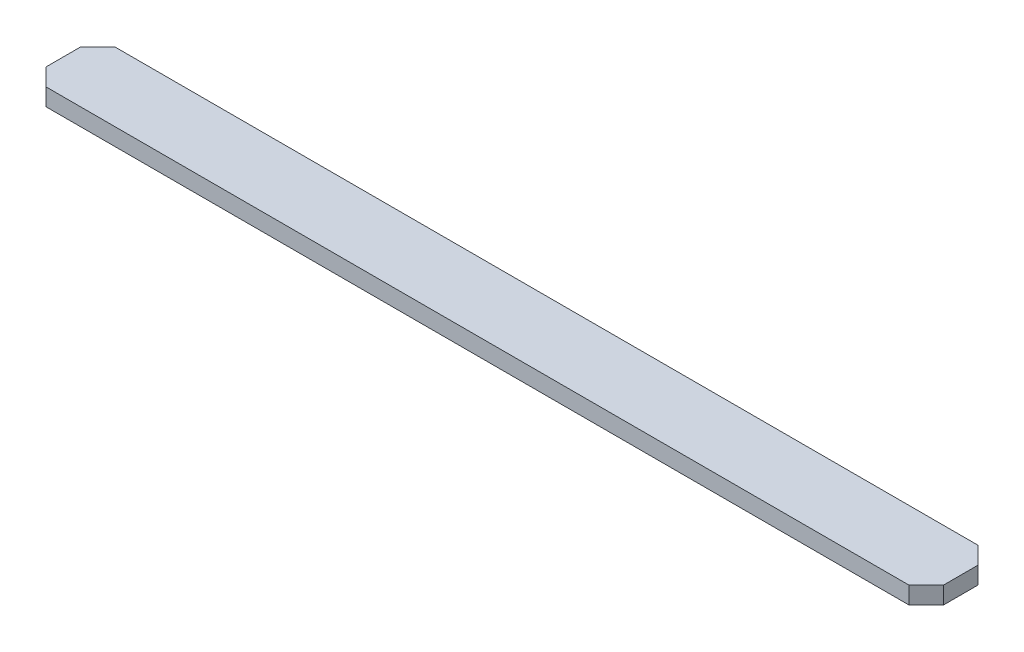
ISO-10303-21;
HEADER;
FILE_DESCRIPTION(('STEP AP214'),'2;1');
FILE_NAME('part.step','',(''),(''),'','','');
FILE_SCHEMA(('AUTOMOTIVE_DESIGN { 1 0 10303 214 1 1 1 1 }'));
ENDSEC;
DATA;
#1=APPLICATION_CONTEXT('core data for automotive mechanical design processes');
#2=APPLICATION_PROTOCOL_DEFINITION('international standard','automotive_design',2000,#1);
#3=PRODUCT_CONTEXT('',#1,'mechanical');
#4=PRODUCT('Part','Part','',(#3));
#5=PRODUCT_RELATED_PRODUCT_CATEGORY('part','',(#4));
#6=PRODUCT_DEFINITION_FORMATION('','',#4);
#7=PRODUCT_DEFINITION_CONTEXT('part definition',#1,'design');
#8=PRODUCT_DEFINITION('design','',#6,#7);
#9=PRODUCT_DEFINITION_SHAPE('','',#8);
#10=(LENGTH_UNIT() NAMED_UNIT(*) SI_UNIT(.MILLI.,.METRE.));
#11=(NAMED_UNIT(*) PLANE_ANGLE_UNIT() SI_UNIT($,.RADIAN.));
#12=(NAMED_UNIT(*) SI_UNIT($,.STERADIAN.) SOLID_ANGLE_UNIT());
#13=UNCERTAINTY_MEASURE_WITH_UNIT(LENGTH_MEASURE(1.E-05),#10,'distance_accuracy_value','');
#14=(GEOMETRIC_REPRESENTATION_CONTEXT(3) GLOBAL_UNCERTAINTY_ASSIGNED_CONTEXT((#13)) GLOBAL_UNIT_ASSIGNED_CONTEXT((#10,
#11,#12)) REPRESENTATION_CONTEXT('',''));
#15=CARTESIAN_POINT('',(0.,0.,0.));
#16=DIRECTION('',(0.,0.,1.));
#17=DIRECTION('',(1.,0.,0.));
#18=AXIS2_PLACEMENT_3D('',#15,#16,#17);
#19=CARTESIAN_POINT('',(26.,1.,-2.));
#20=DIRECTION('',(-1.,0.,0.));
#21=DIRECTION('',(0.,0.,1.));
#22=AXIS2_PLACEMENT_3D('',#19,#20,#21);
#23=PLANE('',#22);
#24=DIRECTION('',(0.,0.,-1.));
#25=VECTOR('',#24,1.);
#26=CARTESIAN_POINT('',(26.,0.,-2.));
#27=LINE('',#26,#25);
#28=CARTESIAN_POINT('',(26.,0.,0.999999999999999));
#29=VERTEX_POINT('',#28);
#30=CARTESIAN_POINT('',(26.,0.,-1.));
#31=VERTEX_POINT('',#30);
#32=EDGE_CURVE('E129',#29,#31,#27,.T.);
#33=ORIENTED_EDGE('',*,*,#32,.T.);
#34=DIRECTION('',(0.,1.,0.));
#35=VECTOR('',#34,1.);
#36=CARTESIAN_POINT('',(26.,1.,-1.));
#37=LINE('',#36,#35);
#38=CARTESIAN_POINT('',(26.,1.,-1.));
#39=VERTEX_POINT('',#38);
#40=EDGE_CURVE('E11',#31,#39,#37,.T.);
#41=ORIENTED_EDGE('',*,*,#40,.T.);
#42=DIRECTION('',(0.,0.,-1.));
#43=VECTOR('',#42,1.);
#44=CARTESIAN_POINT('',(26.,1.,-2.));
#45=LINE('',#44,#43);
#46=CARTESIAN_POINT('',(26.,1.,0.999999999999999));
#47=VERTEX_POINT('',#46);
#48=EDGE_CURVE('E127',#47,#39,#45,.T.);
#49=ORIENTED_EDGE('',*,*,#48,.F.);
#50=DIRECTION('',(0.,-1.,0.));
#51=VECTOR('',#50,1.);
#52=CARTESIAN_POINT('',(26.,1.,0.999999999999999));
#53=LINE('',#52,#51);
#54=EDGE_CURVE('E41',#47,#29,#53,.T.);
#55=ORIENTED_EDGE('',*,*,#54,.T.);
#56=EDGE_LOOP('',(#33,#41,#49,#55));
#57=FACE_BOUND('',#56,.T.);
#58=ADVANCED_FACE('F33',(#57),#23,.F.);
#59=CARTESIAN_POINT('',(-26.,1.,-2.));
#60=DIRECTION('',(0.,0.,1.));
#61=DIRECTION('',(1.,0.,0.));
#62=AXIS2_PLACEMENT_3D('',#59,#60,#61);
#63=PLANE('',#62);
#64=DIRECTION('',(-1.,0.,0.));
#65=VECTOR('',#64,1.);
#66=CARTESIAN_POINT('',(-26.,0.,-2.));
#67=LINE('',#66,#65);
#68=CARTESIAN_POINT('',(25.,0.,-2.));
#69=VERTEX_POINT('',#68);
#70=CARTESIAN_POINT('',(-25.,0.,-2.));
#71=VERTEX_POINT('',#70);
#72=EDGE_CURVE('E125',#69,#71,#67,.T.);
#73=ORIENTED_EDGE('',*,*,#72,.T.);
#74=DIRECTION('',(0.,1.,0.));
#75=VECTOR('',#74,1.);
#76=CARTESIAN_POINT('',(-25.,1.,-2.));
#77=LINE('',#76,#75);
#78=CARTESIAN_POINT('',(-25.,1.,-2.));
#79=VERTEX_POINT('',#78);
#80=EDGE_CURVE('E104',#71,#79,#77,.T.);
#81=ORIENTED_EDGE('',*,*,#80,.T.);
#82=DIRECTION('',(-1.,0.,0.));
#83=VECTOR('',#82,1.);
#84=CARTESIAN_POINT('',(-26.,1.,-2.));
#85=LINE('',#84,#83);
#86=CARTESIAN_POINT('',(25.,1.,-2.));
#87=VERTEX_POINT('',#86);
#88=EDGE_CURVE('E165',#87,#79,#85,.T.);
#89=ORIENTED_EDGE('',*,*,#88,.F.);
#90=DIRECTION('',(0.,-1.,0.));
#91=VECTOR('',#90,1.);
#92=CARTESIAN_POINT('',(25.,1.,-2.));
#93=LINE('',#92,#91);
#94=EDGE_CURVE('E109',#87,#69,#93,.T.);
#95=ORIENTED_EDGE('',*,*,#94,.T.);
#96=EDGE_LOOP('',(#73,#81,#89,#95));
#97=FACE_BOUND('',#96,.T.);
#98=ADVANCED_FACE('F175',(#97),#63,.F.);
#99=CARTESIAN_POINT('',(-26.,1.,-2.));
#100=DIRECTION('',(1.,0.,0.));
#101=DIRECTION('',(0.,0.,-1.));
#102=AXIS2_PLACEMENT_3D('',#99,#100,#101);
#103=PLANE('',#102);
#104=DIRECTION('',(0.,0.,1.));
#105=VECTOR('',#104,1.);
#106=CARTESIAN_POINT('',(-26.,1.,-2.));
#107=LINE('',#106,#105);
#108=CARTESIAN_POINT('',(-26.,1.,-1.));
#109=VERTEX_POINT('',#108);
#110=CARTESIAN_POINT('',(-26.,1.,0.999999999999999));
#111=VERTEX_POINT('',#110);
#112=EDGE_CURVE('E118',#109,#111,#107,.T.);
#113=ORIENTED_EDGE('',*,*,#112,.F.);
#114=DIRECTION('',(0.,-1.,0.));
#115=VECTOR('',#114,1.);
#116=CARTESIAN_POINT('',(-26.,1.,-1.));
#117=LINE('',#116,#115);
#118=CARTESIAN_POINT('',(-26.,0.,-1.));
#119=VERTEX_POINT('',#118);
#120=EDGE_CURVE('E103',#109,#119,#117,.T.);
#121=ORIENTED_EDGE('',*,*,#120,.T.);
#122=DIRECTION('',(0.,0.,1.));
#123=VECTOR('',#122,1.);
#124=CARTESIAN_POINT('',(-26.,0.,-2.));
#125=LINE('',#124,#123);
#126=CARTESIAN_POINT('',(-26.,0.,0.999999999999999));
#127=VERTEX_POINT('',#126);
#128=EDGE_CURVE('E116',#119,#127,#125,.T.);
#129=ORIENTED_EDGE('',*,*,#128,.T.);
#130=DIRECTION('',(0.,1.,0.));
#131=VECTOR('',#130,1.);
#132=CARTESIAN_POINT('',(-26.,1.,0.999999999999999));
#133=LINE('',#132,#131);
#134=EDGE_CURVE('E120',#127,#111,#133,.T.);
#135=ORIENTED_EDGE('',*,*,#134,.T.);
#136=EDGE_LOOP('',(#113,#121,#129,#135));
#137=FACE_BOUND('',#136,.T.);
#138=ADVANCED_FACE('F115',(#137),#103,.F.);
#139=CARTESIAN_POINT('',(-26.,1.,2.));
#140=DIRECTION('',(0.,0.,-1.));
#141=DIRECTION('',(-1.,0.,0.));
#142=AXIS2_PLACEMENT_3D('',#139,#140,#141);
#143=PLANE('',#142);
#144=DIRECTION('',(1.,0.,0.));
#145=VECTOR('',#144,1.);
#146=CARTESIAN_POINT('',(-26.,1.,2.));
#147=LINE('',#146,#145);
#148=CARTESIAN_POINT('',(-25.,1.,2.));
#149=VERTEX_POINT('',#148);
#150=CARTESIAN_POINT('',(25.,1.,2.));
#151=VERTEX_POINT('',#150);
#152=EDGE_CURVE('E133',#149,#151,#147,.T.);
#153=ORIENTED_EDGE('',*,*,#152,.F.);
#154=DIRECTION('',(0.,-1.,0.));
#155=VECTOR('',#154,1.);
#156=CARTESIAN_POINT('',(-25.,1.,2.));
#157=LINE('',#156,#155);
#158=CARTESIAN_POINT('',(-25.,0.,2.));
#159=VERTEX_POINT('',#158);
#160=EDGE_CURVE('E150',#149,#159,#157,.T.);
#161=ORIENTED_EDGE('',*,*,#160,.T.);
#162=DIRECTION('',(1.,0.,0.));
#163=VECTOR('',#162,1.);
#164=CARTESIAN_POINT('',(-26.,0.,2.));
#165=LINE('',#164,#163);
#166=CARTESIAN_POINT('',(25.,0.,2.));
#167=VERTEX_POINT('',#166);
#168=EDGE_CURVE('E124',#159,#167,#165,.T.);
#169=ORIENTED_EDGE('',*,*,#168,.T.);
#170=DIRECTION('',(0.,1.,0.));
#171=VECTOR('',#170,1.);
#172=CARTESIAN_POINT('',(25.,1.,2.));
#173=LINE('',#172,#171);
#174=EDGE_CURVE('E48',#167,#151,#173,.T.);
#175=ORIENTED_EDGE('',*,*,#174,.T.);
#176=EDGE_LOOP('',(#153,#161,#169,#175));
#177=FACE_BOUND('',#176,.T.);
#178=ADVANCED_FACE('F179',(#177),#143,.F.);
#179=CARTESIAN_POINT('',(0.,1.,0.));
#180=DIRECTION('',(0.,1.,0.));
#181=DIRECTION('',(0.,0.,1.));
#182=AXIS2_PLACEMENT_3D('',#179,#180,#181);
#183=PLANE('',#182);
#184=ORIENTED_EDGE('',*,*,#88,.T.);
#185=DIRECTION('',(0.707106781186548,0.,-0.707106781186548));
#186=VECTOR('',#185,1.);
#187=CARTESIAN_POINT('',(-13.5,1.,-13.5));
#188=LINE('',#187,#186);
#189=EDGE_CURVE('E147',#79,#109,#188,.F.);
#190=ORIENTED_EDGE('',*,*,#189,.T.);
#191=ORIENTED_EDGE('',*,*,#112,.T.);
#192=DIRECTION('',(-0.707106781186545,0.,-0.70710678118655));
#193=VECTOR('',#192,1.);
#194=CARTESIAN_POINT('',(-13.5000000000001,1.,13.5));
#195=LINE('',#194,#193);
#196=EDGE_CURVE('E55',#111,#149,#195,.F.);
#197=ORIENTED_EDGE('',*,*,#196,.T.);
#198=ORIENTED_EDGE('',*,*,#152,.T.);
#199=DIRECTION('',(-0.707106781186548,0.,0.707106781186548));
#200=VECTOR('',#199,1.);
#201=CARTESIAN_POINT('',(13.5,1.,13.5));
#202=LINE('',#201,#200);
#203=EDGE_CURVE('E142',#151,#47,#202,.F.);
#204=ORIENTED_EDGE('',*,*,#203,.T.);
#205=ORIENTED_EDGE('',*,*,#48,.T.);
#206=DIRECTION('',(0.707106781186548,0.,0.707106781186548));
#207=VECTOR('',#206,1.);
#208=CARTESIAN_POINT('',(13.5,1.,-13.5));
#209=LINE('',#208,#207);
#210=EDGE_CURVE('E144',#39,#87,#209,.F.);
#211=ORIENTED_EDGE('',*,*,#210,.T.);
#212=EDGE_LOOP('',(#184,#190,#191,#197,#198,#204,#205,#211));
#213=FACE_BOUND('',#212,.T.);
#214=ADVANCED_FACE('F169',(#213),#183,.T.);
#215=CARTESIAN_POINT('',(0.,0.,0.));
#216=DIRECTION('',(0.,1.,0.));
#217=DIRECTION('',(0.,0.,1.));
#218=AXIS2_PLACEMENT_3D('',#215,#216,#217);
#219=PLANE('',#218);
#220=ORIENTED_EDGE('',*,*,#128,.F.);
#221=DIRECTION('',(-0.707106781186548,0.,0.707106781186548));
#222=VECTOR('',#221,1.);
#223=CARTESIAN_POINT('',(-26.,0.,-1.));
#224=LINE('',#223,#222);
#225=EDGE_CURVE('E99',#119,#71,#224,.F.);
#226=ORIENTED_EDGE('',*,*,#225,.T.);
#227=ORIENTED_EDGE('',*,*,#72,.F.);
#228=DIRECTION('',(-0.707106781186548,0.,-0.707106781186548));
#229=VECTOR('',#228,1.);
#230=CARTESIAN_POINT('',(25.,0.,-2.));
#231=LINE('',#230,#229);
#232=EDGE_CURVE('E136',#69,#31,#231,.F.);
#233=ORIENTED_EDGE('',*,*,#232,.T.);
#234=ORIENTED_EDGE('',*,*,#32,.F.);
#235=DIRECTION('',(0.707106781186548,0.,-0.707106781186548));
#236=VECTOR('',#235,1.);
#237=CARTESIAN_POINT('',(26.,0.,0.999999999999999));
#238=LINE('',#237,#236);
#239=EDGE_CURVE('E119',#29,#167,#238,.F.);
#240=ORIENTED_EDGE('',*,*,#239,.T.);
#241=ORIENTED_EDGE('',*,*,#168,.F.);
#242=DIRECTION('',(0.707106781186545,0.,0.70710678118655));
#243=VECTOR('',#242,1.);
#244=CARTESIAN_POINT('',(-25.,0.,2.));
#245=LINE('',#244,#243);
#246=EDGE_CURVE('E110',#159,#127,#245,.F.);
#247=ORIENTED_EDGE('',*,*,#246,.T.);
#248=EDGE_LOOP('',(#220,#226,#227,#233,#234,#240,#241,#247));
#249=FACE_BOUND('',#248,.T.);
#250=ADVANCED_FACE('F122',(#249),#219,.F.);
#251=CARTESIAN_POINT('',(-26.,1.,-1.));
#252=DIRECTION('',(0.707106781186547,0.,0.707106781186547));
#253=DIRECTION('',(0.,-1.,0.));
#254=AXIS2_PLACEMENT_3D('',#251,#252,#253);
#255=PLANE('',#254);
#256=ORIENTED_EDGE('',*,*,#189,.F.);
#257=ORIENTED_EDGE('',*,*,#80,.F.);
#258=ORIENTED_EDGE('',*,*,#225,.F.);
#259=ORIENTED_EDGE('',*,*,#120,.F.);
#260=EDGE_LOOP('',(#256,#257,#258,#259));
#261=FACE_BOUND('',#260,.T.);
#262=ADVANCED_FACE('F102',(#261),#255,.F.);
#263=CARTESIAN_POINT('',(-25.,1.,2.));
#264=DIRECTION('',(0.70710678118655,0.,-0.707106781186545));
#265=DIRECTION('',(0.,-1.,0.));
#266=AXIS2_PLACEMENT_3D('',#263,#264,#265);
#267=PLANE('',#266);
#268=ORIENTED_EDGE('',*,*,#196,.F.);
#269=ORIENTED_EDGE('',*,*,#134,.F.);
#270=ORIENTED_EDGE('',*,*,#246,.F.);
#271=ORIENTED_EDGE('',*,*,#160,.F.);
#272=EDGE_LOOP('',(#268,#269,#270,#271));
#273=FACE_BOUND('',#272,.T.);
#274=ADVANCED_FACE('F178',(#273),#267,.F.);
#275=CARTESIAN_POINT('',(25.,1.,-2.));
#276=DIRECTION('',(-0.707106781186547,0.,0.707106781186547));
#277=DIRECTION('',(0.,-1.,0.));
#278=AXIS2_PLACEMENT_3D('',#275,#276,#277);
#279=PLANE('',#278);
#280=ORIENTED_EDGE('',*,*,#210,.F.);
#281=ORIENTED_EDGE('',*,*,#40,.F.);
#282=ORIENTED_EDGE('',*,*,#232,.F.);
#283=ORIENTED_EDGE('',*,*,#94,.F.);
#284=EDGE_LOOP('',(#280,#281,#282,#283));
#285=FACE_BOUND('',#284,.T.);
#286=ADVANCED_FACE('F173',(#285),#279,.F.);
#287=CARTESIAN_POINT('',(26.,1.,0.999999999999999));
#288=DIRECTION('',(-0.707106781186547,0.,-0.707106781186547));
#289=DIRECTION('',(0.,-1.,0.));
#290=AXIS2_PLACEMENT_3D('',#287,#288,#289);
#291=PLANE('',#290);
#292=ORIENTED_EDGE('',*,*,#203,.F.);
#293=ORIENTED_EDGE('',*,*,#174,.F.);
#294=ORIENTED_EDGE('',*,*,#239,.F.);
#295=ORIENTED_EDGE('',*,*,#54,.F.);
#296=EDGE_LOOP('',(#292,#293,#294,#295));
#297=FACE_BOUND('',#296,.T.);
#298=ADVANCED_FACE('F35',(#297),#291,.F.);
#299=CLOSED_SHELL('',(#58,#98,#138,#178,#214,#250,#262,#274,#286,#298));
#300=MANIFOLD_SOLID_BREP('B2',#299);
#301=ADVANCED_BREP_SHAPE_REPRESENTATION('',(#18,#300),#14);
#302=SHAPE_DEFINITION_REPRESENTATION(#9,#301);
ENDSEC;
END-ISO-10303-21;
